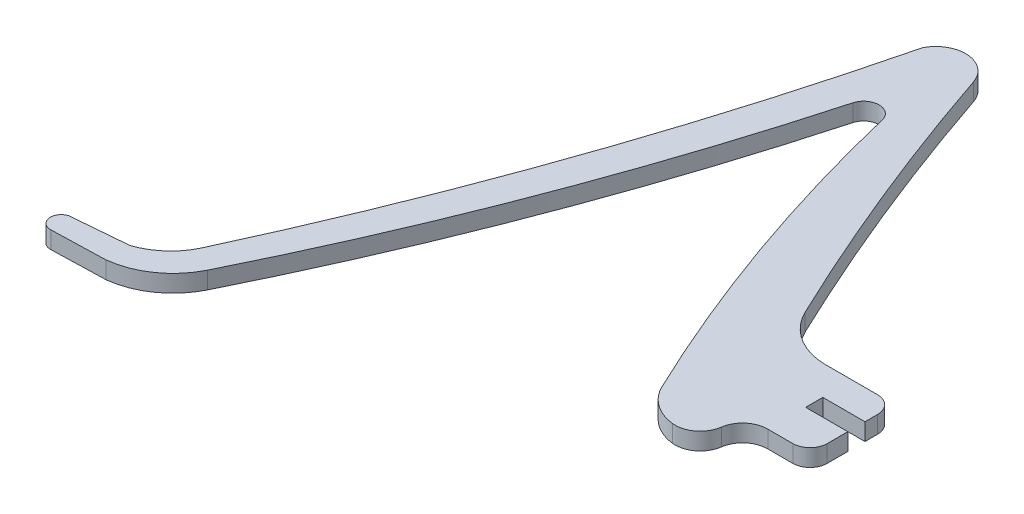
ISO-10303-21;
HEADER;
FILE_DESCRIPTION(('STEP AP214'),'2;1');
FILE_NAME('part.step','',(''),(''),'','','');
FILE_SCHEMA(('AUTOMOTIVE_DESIGN { 1 0 10303 214 1 1 1 1 }'));
ENDSEC;
DATA;
#1=APPLICATION_CONTEXT('core data for automotive mechanical design processes');
#2=APPLICATION_PROTOCOL_DEFINITION('international standard','automotive_design',2000,#1);
#3=PRODUCT_CONTEXT('',#1,'mechanical');
#4=PRODUCT('Part','Part','',(#3));
#5=PRODUCT_RELATED_PRODUCT_CATEGORY('part','',(#4));
#6=PRODUCT_DEFINITION_FORMATION('','',#4);
#7=PRODUCT_DEFINITION_CONTEXT('part definition',#1,'design');
#8=PRODUCT_DEFINITION('design','',#6,#7);
#9=PRODUCT_DEFINITION_SHAPE('','',#8);
#10=(LENGTH_UNIT() NAMED_UNIT(*) SI_UNIT(.MILLI.,.METRE.));
#11=(NAMED_UNIT(*) PLANE_ANGLE_UNIT() SI_UNIT($,.RADIAN.));
#12=(NAMED_UNIT(*) SI_UNIT($,.STERADIAN.) SOLID_ANGLE_UNIT());
#13=UNCERTAINTY_MEASURE_WITH_UNIT(LENGTH_MEASURE(1.E-05),#10,'distance_accuracy_value','');
#14=(GEOMETRIC_REPRESENTATION_CONTEXT(3) GLOBAL_UNCERTAINTY_ASSIGNED_CONTEXT((#13)) GLOBAL_UNIT_ASSIGNED_CONTEXT((#10,
#11,#12)) REPRESENTATION_CONTEXT('',''));
#15=CARTESIAN_POINT('',(0.,0.,0.));
#16=DIRECTION('',(0.,0.,1.));
#17=DIRECTION('',(1.,0.,0.));
#18=AXIS2_PLACEMENT_3D('',#15,#16,#17);
#19=CARTESIAN_POINT('',(-41736.5703119899,3.,-18202.859375344));
#20=DIRECTION('',(0.,-1.,0.));
#21=DIRECTION('',(0.,0.,-1.));
#22=AXIS2_PLACEMENT_3D('',#19,#20,#21);
#23=CYLINDRICAL_SURFACE('',#22,1.87725099870067);
#24=CARTESIAN_POINT('',(-41736.5703119899,0.,-18202.859375344));
#25=DIRECTION('',(0.,1.,0.));
#26=DIRECTION('',(0.,0.,1.));
#27=AXIS2_PLACEMENT_3D('',#24,#25,#26);
#28=CIRCLE('',#27,1.87725099870067);
#29=CARTESIAN_POINT('',(-41736.402871,0.,-18204.729144));
#30=VERTEX_POINT('',#29);
#31=CARTESIAN_POINT('',(-41736.517584,0.,-18200.982865));
#32=VERTEX_POINT('',#31);
#33=EDGE_CURVE('E227',#30,#32,#28,.T.);
#34=ORIENTED_EDGE('',*,*,#33,.T.);
#35=DIRECTION('',(0.,-1.,0.));
#36=VECTOR('',#35,1.);
#37=CARTESIAN_POINT('',(-41736.517584,3.,-18200.982865));
#38=LINE('',#37,#36);
#39=CARTESIAN_POINT('',(-41736.517584,3.,-18200.982865));
#40=VERTEX_POINT('',#39);
#41=EDGE_CURVE('E11',#40,#32,#38,.T.);
#42=ORIENTED_EDGE('',*,*,#41,.F.);
#43=CARTESIAN_POINT('',(-41736.5703119899,3.,-18202.859375344));
#44=DIRECTION('',(0.,1.,0.));
#45=DIRECTION('',(0.,0.,1.));
#46=AXIS2_PLACEMENT_3D('',#43,#44,#45);
#47=CIRCLE('',#46,1.87725099870067);
#48=CARTESIAN_POINT('',(-41736.402871,3.,-18204.729144));
#49=VERTEX_POINT('',#48);
#50=EDGE_CURVE('E273',#49,#40,#47,.T.);
#51=ORIENTED_EDGE('',*,*,#50,.F.);
#52=DIRECTION('',(0.,-1.,0.));
#53=VECTOR('',#52,1.);
#54=CARTESIAN_POINT('',(-41736.402871,3.,-18204.729144));
#55=LINE('',#54,#53);
#56=EDGE_CURVE('E223',#49,#30,#55,.T.);
#57=ORIENTED_EDGE('',*,*,#56,.T.);
#58=EDGE_LOOP('',(#34,#42,#51,#57));
#59=FACE_BOUND('',#58,.T.);
#60=ADVANCED_FACE('F35',(#59),#23,.T.);
#61=CARTESIAN_POINT('',(-41736.517584,3.,-18200.982865));
#62=DIRECTION('',(-0.0281516864041227,0.,-0.999603662734688));
#63=DIRECTION('',(-0.999603662734688,0.,0.0281516864041227));
#64=AXIS2_PLACEMENT_3D('',#61,#62,#63);
#65=PLANE('',#64);
#66=DIRECTION('',(0.999603662734688,0.,-0.0281516864041227));
#67=VECTOR('',#66,1.);
#68=CARTESIAN_POINT('',(-41736.517584,0.,-18200.982865));
#69=LINE('',#68,#67);
#70=CARTESIAN_POINT('',(-41727.101562,0.,-18201.248047));
#71=VERTEX_POINT('',#70);
#72=EDGE_CURVE('E230',#32,#71,#69,.T.);
#73=ORIENTED_EDGE('',*,*,#72,.T.);
#74=DIRECTION('',(0.,-1.,0.));
#75=VECTOR('',#74,1.);
#76=CARTESIAN_POINT('',(-41727.101562,3.,-18201.248047));
#77=LINE('',#76,#75);
#78=CARTESIAN_POINT('',(-41727.101562,3.,-18201.248047));
#79=VERTEX_POINT('',#78);
#80=EDGE_CURVE('E43',#79,#71,#77,.T.);
#81=ORIENTED_EDGE('',*,*,#80,.F.);
#82=DIRECTION('',(0.999603662734688,0.,-0.0281516864041227));
#83=VECTOR('',#82,1.);
#84=CARTESIAN_POINT('',(-41736.517584,3.,-18200.982865));
#85=LINE('',#84,#83);
#86=EDGE_CURVE('E142',#40,#79,#85,.T.);
#87=ORIENTED_EDGE('',*,*,#86,.F.);
#88=ORIENTED_EDGE('',*,*,#41,.T.);
#89=EDGE_LOOP('',(#73,#81,#87,#88));
#90=FACE_BOUND('',#89,.T.);
#91=ADVANCED_FACE('F411',(#90),#65,.F.);
#92=CARTESIAN_POINT('',(-41728.6495248528,3.,-18214.4523570761));
#93=DIRECTION('',(0.,-1.,0.));
#94=DIRECTION('',(0.,0.,-1.));
#95=AXIS2_PLACEMENT_3D('',#92,#93,#94);
#96=CYLINDRICAL_SURFACE('',#95,13.2947355587996);
#97=CARTESIAN_POINT('',(-41728.6495248528,0.,-18214.4523570761));
#98=DIRECTION('',(0.,1.,0.));
#99=DIRECTION('',(0.,0.,1.));
#100=AXIS2_PLACEMENT_3D('',#97,#98,#99);
#101=CIRCLE('',#100,13.2947355587996);
#102=CARTESIAN_POINT('',(-41716.7257579999,0.,-18208.57241));
#103=VERTEX_POINT('',#102);
#104=EDGE_CURVE('E232',#71,#103,#101,.T.);
#105=ORIENTED_EDGE('',*,*,#104,.T.);
#106=DIRECTION('',(0.,-1.,0.));
#107=VECTOR('',#106,1.);
#108=CARTESIAN_POINT('',(-41716.7257579999,3.,-18208.57241));
#109=LINE('',#108,#107);
#110=CARTESIAN_POINT('',(-41716.7257579999,3.,-18208.57241));
#111=VERTEX_POINT('',#110);
#112=EDGE_CURVE('E328',#111,#103,#109,.T.);
#113=ORIENTED_EDGE('',*,*,#112,.F.);
#114=CARTESIAN_POINT('',(-41728.6495248528,3.,-18214.4523570761));
#115=DIRECTION('',(0.,1.,0.));
#116=DIRECTION('',(0.,0.,1.));
#117=AXIS2_PLACEMENT_3D('',#114,#115,#116);
#118=CIRCLE('',#117,13.2947355587996);
#119=EDGE_CURVE('E336',#79,#111,#118,.T.);
#120=ORIENTED_EDGE('',*,*,#119,.F.);
#121=ORIENTED_EDGE('',*,*,#80,.T.);
#122=EDGE_LOOP('',(#105,#113,#120,#121));
#123=FACE_BOUND('',#122,.T.);
#124=ADVANCED_FACE('F334',(#123),#96,.T.);
#125=CARTESIAN_POINT('',(-42129.610875578,3.,-18412.1957815943));
#126=DIRECTION('',(0.,-1.,0.));
#127=DIRECTION('',(0.,0.,-1.));
#128=AXIS2_PLACEMENT_3D('',#125,#126,#127);
#129=CYLINDRICAL_SURFACE('',#128,460.365721765698);
#130=CARTESIAN_POINT('',(-42129.610875578,0.,-18412.1957815943));
#131=DIRECTION('',(0.,1.,0.));
#132=DIRECTION('',(0.,0.,1.));
#133=AXIS2_PLACEMENT_3D('',#130,#131,#132);
#134=CIRCLE('',#133,460.365721765698);
#135=CARTESIAN_POINT('',(-41685.712916,0.,-18290.1662800001));
#136=VERTEX_POINT('',#135);
#137=EDGE_CURVE('E234',#103,#136,#134,.T.);
#138=ORIENTED_EDGE('',*,*,#137,.T.);
#139=DIRECTION('',(0.,-1.,0.));
#140=VECTOR('',#139,1.);
#141=CARTESIAN_POINT('',(-41685.712916,3.,-18290.1662800001));
#142=LINE('',#141,#140);
#143=CARTESIAN_POINT('',(-41685.712916,3.,-18290.1662800001));
#144=VERTEX_POINT('',#143);
#145=EDGE_CURVE('E325',#144,#136,#142,.T.);
#146=ORIENTED_EDGE('',*,*,#145,.F.);
#147=CARTESIAN_POINT('',(-42129.610875578,3.,-18412.1957815943));
#148=DIRECTION('',(0.,1.,0.));
#149=DIRECTION('',(0.,0.,1.));
#150=AXIS2_PLACEMENT_3D('',#147,#148,#149);
#151=CIRCLE('',#150,460.365721765698);
#152=EDGE_CURVE('E354',#111,#144,#151,.T.);
#153=ORIENTED_EDGE('',*,*,#152,.F.);
#154=ORIENTED_EDGE('',*,*,#112,.T.);
#155=EDGE_LOOP('',(#138,#146,#153,#154));
#156=FACE_BOUND('',#155,.T.);
#157=ADVANCED_FACE('F345',(#156),#129,.T.);
#158=CARTESIAN_POINT('',(-41683.1202207019,3.,-18289.4531815504));
#159=DIRECTION('',(0.,-1.,0.));
#160=DIRECTION('',(0.,0.,-1.));
#161=AXIS2_PLACEMENT_3D('',#158,#159,#160);
#162=CYLINDRICAL_SURFACE('',#161,2.68897346726469);
#163=CARTESIAN_POINT('',(-41683.1202207019,0.,-18289.4531815504));
#164=DIRECTION('',(0.,-1.,0.));
#165=DIRECTION('',(0.,0.,1.));
#166=AXIS2_PLACEMENT_3D('',#163,#164,#165);
#167=CIRCLE('',#166,2.68897346726469);
#168=CARTESIAN_POINT('',(-41680.641146,0.,-18290.494703));
#169=VERTEX_POINT('',#168);
#170=EDGE_CURVE('E236',#136,#169,#167,.T.);
#171=ORIENTED_EDGE('',*,*,#170,.T.);
#172=DIRECTION('',(0.,-1.,0.));
#173=VECTOR('',#172,1.);
#174=CARTESIAN_POINT('',(-41680.641146,3.,-18290.494703));
#175=LINE('',#174,#173);
#176=CARTESIAN_POINT('',(-41680.641146,3.,-18290.494703));
#177=VERTEX_POINT('',#176);
#178=EDGE_CURVE('E322',#177,#169,#175,.T.);
#179=ORIENTED_EDGE('',*,*,#178,.F.);
#180=CARTESIAN_POINT('',(-41683.1202207019,3.,-18289.4531815504));
#181=DIRECTION('',(0.,-1.,0.));
#182=DIRECTION('',(0.,0.,1.));
#183=AXIS2_PLACEMENT_3D('',#180,#181,#182);
#184=CIRCLE('',#183,2.68897346726469);
#185=EDGE_CURVE('E351',#144,#177,#184,.T.);
#186=ORIENTED_EDGE('',*,*,#185,.F.);
#187=ORIENTED_EDGE('',*,*,#145,.T.);
#188=EDGE_LOOP('',(#171,#179,#186,#187));
#189=FACE_BOUND('',#188,.T.);
#190=ADVANCED_FACE('F349',(#189),#162,.F.);
#191=CARTESIAN_POINT('',(-41388.5252984147,3.,-18360.1380724928));
#192=DIRECTION('',(0.,-1.,0.));
#193=DIRECTION('',(0.,0.,-1.));
#194=AXIS2_PLACEMENT_3D('',#191,#192,#193);
#195=CYLINDRICAL_SURFACE('',#194,300.302959234102);
#196=CARTESIAN_POINT('',(-41388.5252984147,0.,-18360.1380724928));
#197=DIRECTION('',(0.,1.,0.));
#198=DIRECTION('',(0.,0.,1.));
#199=AXIS2_PLACEMENT_3D('',#196,#197,#198);
#200=CIRCLE('',#199,300.302959234102);
#201=CARTESIAN_POINT('',(-41659.432339,0.,-18230.5570450002));
#202=VERTEX_POINT('',#201);
#203=EDGE_CURVE('E238',#169,#202,#200,.T.);
#204=ORIENTED_EDGE('',*,*,#203,.T.);
#205=DIRECTION('',(0.,-1.,0.));
#206=VECTOR('',#205,1.);
#207=CARTESIAN_POINT('',(-41659.432339,3.,-18230.5570450002));
#208=LINE('',#207,#206);
#209=CARTESIAN_POINT('',(-41659.432339,3.,-18230.5570450002));
#210=VERTEX_POINT('',#209);
#211=EDGE_CURVE('E319',#210,#202,#208,.T.);
#212=ORIENTED_EDGE('',*,*,#211,.F.);
#213=CARTESIAN_POINT('',(-41388.5252984147,3.,-18360.1380724928));
#214=DIRECTION('',(0.,1.,0.));
#215=DIRECTION('',(0.,0.,1.));
#216=AXIS2_PLACEMENT_3D('',#213,#214,#215);
#217=CIRCLE('',#216,300.302959234102);
#218=EDGE_CURVE('E353',#177,#210,#217,.T.);
#219=ORIENTED_EDGE('',*,*,#218,.F.);
#220=ORIENTED_EDGE('',*,*,#178,.T.);
#221=EDGE_LOOP('',(#204,#212,#219,#220));
#222=FACE_BOUND('',#221,.T.);
#223=ADVANCED_FACE('F424',(#222),#195,.T.);
#224=CARTESIAN_POINT('',(-41652.049504064,3.,-18234.0869775304));
#225=DIRECTION('',(0.,-1.,0.));
#226=DIRECTION('',(0.,0.,-1.));
#227=AXIS2_PLACEMENT_3D('',#224,#225,#226);
#228=CYLINDRICAL_SURFACE('',#227,8.18331689239969);
#229=CARTESIAN_POINT('',(-41652.049504064,0.,-18234.0869775304));
#230=DIRECTION('',(0.,1.,0.));
#231=DIRECTION('',(0.,0.,1.));
#232=AXIS2_PLACEMENT_3D('',#229,#230,#231);
#233=CIRCLE('',#232,8.18331689239969);
#234=CARTESIAN_POINT('',(-41653.00576,0.,-18225.9597240001));
#235=VERTEX_POINT('',#234);
#236=EDGE_CURVE('E240',#202,#235,#233,.T.);
#237=ORIENTED_EDGE('',*,*,#236,.T.);
#238=DIRECTION('',(0.,-1.,0.));
#239=VECTOR('',#238,1.);
#240=CARTESIAN_POINT('',(-41653.00576,3.,-18225.9597240001));
#241=LINE('',#240,#239);
#242=CARTESIAN_POINT('',(-41653.00576,3.,-18225.9597240001));
#243=VERTEX_POINT('',#242);
#244=EDGE_CURVE('E316',#243,#235,#241,.T.);
#245=ORIENTED_EDGE('',*,*,#244,.F.);
#246=CARTESIAN_POINT('',(-41652.049504064,3.,-18234.0869775304));
#247=DIRECTION('',(0.,1.,0.));
#248=DIRECTION('',(0.,0.,1.));
#249=AXIS2_PLACEMENT_3D('',#246,#247,#248);
#250=CIRCLE('',#249,8.18331689239969);
#251=EDGE_CURVE('E356',#210,#243,#250,.T.);
#252=ORIENTED_EDGE('',*,*,#251,.F.);
#253=ORIENTED_EDGE('',*,*,#211,.T.);
#254=EDGE_LOOP('',(#237,#245,#252,#253));
#255=FACE_BOUND('',#254,.T.);
#256=ADVANCED_FACE('F427',(#255),#228,.T.);
#257=CARTESIAN_POINT('',(-41652.4920338298,3.,-18230.2989458031));
#258=DIRECTION('',(0.,-1.,0.));
#259=DIRECTION('',(0.,0.,-1.));
#260=AXIS2_PLACEMENT_3D('',#257,#258,#259);
#261=CYLINDRICAL_SURFACE('',#260,4.36952633969769);
#262=CARTESIAN_POINT('',(-41652.4920338298,0.,-18230.2989458031));
#263=DIRECTION('',(0.,1.,0.));
#264=DIRECTION('',(0.,0.,1.));
#265=AXIS2_PLACEMENT_3D('',#262,#263,#264);
#266=CIRCLE('',#265,4.36952633969769);
#267=CARTESIAN_POINT('',(-41648.166319,0.,-18229.681733));
#268=VERTEX_POINT('',#267);
#269=EDGE_CURVE('E242',#235,#268,#266,.T.);
#270=ORIENTED_EDGE('',*,*,#269,.T.);
#271=DIRECTION('',(0.,-1.,0.));
#272=VECTOR('',#271,1.);
#273=CARTESIAN_POINT('',(-41648.166319,3.,-18229.681733));
#274=LINE('',#273,#272);
#275=CARTESIAN_POINT('',(-41648.166319,3.,-18229.681733));
#276=VERTEX_POINT('',#275);
#277=EDGE_CURVE('E313',#276,#268,#274,.T.);
#278=ORIENTED_EDGE('',*,*,#277,.F.);
#279=CARTESIAN_POINT('',(-41652.4920338298,3.,-18230.2989458031));
#280=DIRECTION('',(0.,1.,0.));
#281=DIRECTION('',(0.,0.,1.));
#282=AXIS2_PLACEMENT_3D('',#279,#280,#281);
#283=CIRCLE('',#282,4.36952633969769);
#284=EDGE_CURVE('E362',#243,#276,#283,.T.);
#285=ORIENTED_EDGE('',*,*,#284,.F.);
#286=ORIENTED_EDGE('',*,*,#244,.T.);
#287=EDGE_LOOP('',(#270,#278,#285,#286));
#288=FACE_BOUND('',#287,.T.);
#289=ADVANCED_FACE('F431',(#288),#261,.T.);
#290=CARTESIAN_POINT('',(-41643.8549400753,3.,-18229.0668609535));
#291=DIRECTION('',(0.,-1.,0.));
#292=DIRECTION('',(0.,0.,-1.));
#293=AXIS2_PLACEMENT_3D('',#290,#291,#292);
#294=CYLINDRICAL_SURFACE('',#293,4.35500354369241);
#295=CARTESIAN_POINT('',(-41643.8549400753,0.,-18229.0668609535));
#296=DIRECTION('',(0.,-1.,0.));
#297=DIRECTION('',(0.,0.,1.));
#298=AXIS2_PLACEMENT_3D('',#295,#296,#297);
#299=CIRCLE('',#298,4.35500354369241);
#300=CARTESIAN_POINT('',(-41643.818257,0.,-18233.42171));
#301=VERTEX_POINT('',#300);
#302=EDGE_CURVE('E244',#268,#301,#299,.T.);
#303=ORIENTED_EDGE('',*,*,#302,.T.);
#304=DIRECTION('',(0.,-1.,0.));
#305=VECTOR('',#304,1.);
#306=CARTESIAN_POINT('',(-41643.818257,3.,-18233.42171));
#307=LINE('',#306,#305);
#308=CARTESIAN_POINT('',(-41643.818257,3.,-18233.42171));
#309=VERTEX_POINT('',#308);
#310=EDGE_CURVE('E310',#309,#301,#307,.T.);
#311=ORIENTED_EDGE('',*,*,#310,.F.);
#312=CARTESIAN_POINT('',(-41643.8549400753,3.,-18229.0668609535));
#313=DIRECTION('',(0.,-1.,0.));
#314=DIRECTION('',(0.,0.,1.));
#315=AXIS2_PLACEMENT_3D('',#312,#313,#314);
#316=CIRCLE('',#315,4.35500354369241);
#317=EDGE_CURVE('E364',#276,#309,#316,.T.);
#318=ORIENTED_EDGE('',*,*,#317,.F.);
#319=ORIENTED_EDGE('',*,*,#277,.T.);
#320=EDGE_LOOP('',(#303,#311,#318,#319));
#321=FACE_BOUND('',#320,.T.);
#322=ADVANCED_FACE('F435',(#321),#294,.F.);
#323=CARTESIAN_POINT('',(-41643.818257,3.,-18233.42171));
#324=DIRECTION('',(-0.000483909498973431,0.,-0.999999882915791));
#325=DIRECTION('',(-0.999999882915792,0.,0.000483909498973431));
#326=AXIS2_PLACEMENT_3D('',#323,#324,#325);
#327=PLANE('',#326);
#328=DIRECTION('',(0.999999882915791,0.,-0.000483909498973431));
#329=VECTOR('',#328,1.);
#330=CARTESIAN_POINT('',(-41643.818257,0.,-18233.42171));
#331=LINE('',#330,#329);
#332=CARTESIAN_POINT('',(-41639.441406,0.,-18233.423828));
#333=VERTEX_POINT('',#332);
#334=EDGE_CURVE('E246',#301,#333,#331,.T.);
#335=ORIENTED_EDGE('',*,*,#334,.T.);
#336=DIRECTION('',(0.,-1.,0.));
#337=VECTOR('',#336,1.);
#338=CARTESIAN_POINT('',(-41639.441406,3.,-18233.423828));
#339=LINE('',#338,#337);
#340=CARTESIAN_POINT('',(-41639.441406,3.,-18233.423828));
#341=VERTEX_POINT('',#340);
#342=EDGE_CURVE('E307',#341,#333,#339,.T.);
#343=ORIENTED_EDGE('',*,*,#342,.F.);
#344=DIRECTION('',(0.999999882915791,0.,-0.000483909498973431));
#345=VECTOR('',#344,1.);
#346=CARTESIAN_POINT('',(-41643.818257,3.,-18233.42171));
#347=LINE('',#346,#345);
#348=EDGE_CURVE('E366',#309,#341,#347,.T.);
#349=ORIENTED_EDGE('',*,*,#348,.F.);
#350=ORIENTED_EDGE('',*,*,#310,.T.);
#351=EDGE_LOOP('',(#335,#343,#349,#350));
#352=FACE_BOUND('',#351,.T.);
#353=ADVANCED_FACE('F439',(#352),#327,.F.);
#354=CARTESIAN_POINT('',(-41639.4423819775,3.,-18236.4248038828));
#355=DIRECTION('',(0.,-1.,0.));
#356=DIRECTION('',(0.,0.,-1.));
#357=AXIS2_PLACEMENT_3D('',#354,#355,#356);
#358=CYLINDRICAL_SURFACE('',#357,3.00097604149666);
#359=CARTESIAN_POINT('',(-41639.4423819775,0.,-18236.4248038828));
#360=DIRECTION('',(0.,1.,0.));
#361=DIRECTION('',(0.,0.,1.));
#362=AXIS2_PLACEMENT_3D('',#359,#360,#361);
#363=CIRCLE('',#362,3.00097604149666);
#364=CARTESIAN_POINT('',(-41636.441407,0.,-18236.427331));
#365=VERTEX_POINT('',#364);
#366=EDGE_CURVE('E248',#333,#365,#363,.T.);
#367=ORIENTED_EDGE('',*,*,#366,.T.);
#368=DIRECTION('',(0.,-1.,0.));
#369=VECTOR('',#368,1.);
#370=CARTESIAN_POINT('',(-41636.441407,3.,-18236.427331));
#371=LINE('',#370,#369);
#372=CARTESIAN_POINT('',(-41636.441407,3.,-18236.427331));
#373=VERTEX_POINT('',#372);
#374=EDGE_CURVE('E304',#373,#365,#371,.T.);
#375=ORIENTED_EDGE('',*,*,#374,.F.);
#376=CARTESIAN_POINT('',(-41639.4423819775,3.,-18236.4248038828));
#377=DIRECTION('',(0.,1.,0.));
#378=DIRECTION('',(0.,0.,1.));
#379=AXIS2_PLACEMENT_3D('',#376,#377,#378);
#380=CIRCLE('',#379,3.00097604149666);
#381=EDGE_CURVE('E368',#341,#373,#380,.T.);
#382=ORIENTED_EDGE('',*,*,#381,.F.);
#383=ORIENTED_EDGE('',*,*,#342,.T.);
#384=EDGE_LOOP('',(#367,#375,#382,#383));
#385=FACE_BOUND('',#384,.T.);
#386=ADVANCED_FACE('F443',(#385),#358,.T.);
#387=CARTESIAN_POINT('',(-41636.441407,3.,-18236.427331));
#388=DIRECTION('',(-0.999999409773687,0.,0.00108648620675218));
#389=DIRECTION('',(0.00108648620675218,0.,0.999999409773687));
#390=AXIS2_PLACEMENT_3D('',#387,#388,#389);
#391=PLANE('',#390);
#392=DIRECTION('',(-0.00108648620675218,0.,-0.999999409773687));
#393=VECTOR('',#392,1.);
#394=CARTESIAN_POINT('',(-41636.441407,0.,-18236.427331));
#395=LINE('',#394,#393);
#396=CARTESIAN_POINT('',(-41636.445312,0.,-18240.021484));
#397=VERTEX_POINT('',#396);
#398=EDGE_CURVE('E250',#365,#397,#395,.T.);
#399=ORIENTED_EDGE('',*,*,#398,.T.);
#400=DIRECTION('',(0.,-1.,0.));
#401=VECTOR('',#400,1.);
#402=CARTESIAN_POINT('',(-41636.445312,3.,-18240.021484));
#403=LINE('',#402,#401);
#404=CARTESIAN_POINT('',(-41636.445312,3.,-18240.021484));
#405=VERTEX_POINT('',#404);
#406=EDGE_CURVE('E301',#405,#397,#403,.T.);
#407=ORIENTED_EDGE('',*,*,#406,.F.);
#408=DIRECTION('',(-0.00108648620675218,0.,-0.999999409773687));
#409=VECTOR('',#408,1.);
#410=CARTESIAN_POINT('',(-41636.441407,3.,-18236.427331));
#411=LINE('',#410,#409);
#412=EDGE_CURVE('E370',#373,#405,#411,.T.);
#413=ORIENTED_EDGE('',*,*,#412,.F.);
#414=ORIENTED_EDGE('',*,*,#374,.T.);
#415=EDGE_LOOP('',(#399,#407,#413,#414));
#416=FACE_BOUND('',#415,.T.);
#417=ADVANCED_FACE('F447',(#416),#391,.F.);
#418=CARTESIAN_POINT('',(-41636.445312,3.,-18240.021484));
#419=DIRECTION('',(0.,0.,1.));
#420=DIRECTION('',(1.,0.,0.));
#421=AXIS2_PLACEMENT_3D('',#418,#419,#420);
#422=PLANE('',#421);
#423=DIRECTION('',(-1.,0.,0.));
#424=VECTOR('',#423,1.);
#425=CARTESIAN_POINT('',(-41636.445312,0.,-18240.021484));
#426=LINE('',#425,#424);
#427=CARTESIAN_POINT('',(-41643.804687,0.,-18240.021484));
#428=VERTEX_POINT('',#427);
#429=EDGE_CURVE('E252',#397,#428,#426,.T.);
#430=ORIENTED_EDGE('',*,*,#429,.T.);
#431=DIRECTION('',(0.,-1.,0.));
#432=VECTOR('',#431,1.);
#433=CARTESIAN_POINT('',(-41643.804687,3.,-18240.021484));
#434=LINE('',#433,#432);
#435=CARTESIAN_POINT('',(-41643.804687,3.,-18240.021484));
#436=VERTEX_POINT('',#435);
#437=EDGE_CURVE('E298',#436,#428,#434,.T.);
#438=ORIENTED_EDGE('',*,*,#437,.F.);
#439=DIRECTION('',(-1.,0.,0.));
#440=VECTOR('',#439,1.);
#441=CARTESIAN_POINT('',(-41636.445312,3.,-18240.021484));
#442=LINE('',#441,#440);
#443=EDGE_CURVE('E372',#405,#436,#442,.T.);
#444=ORIENTED_EDGE('',*,*,#443,.F.);
#445=ORIENTED_EDGE('',*,*,#406,.T.);
#446=EDGE_LOOP('',(#430,#438,#444,#445));
#447=FACE_BOUND('',#446,.T.);
#448=ADVANCED_FACE('F451',(#447),#422,.F.);
#449=CARTESIAN_POINT('',(-41643.804687,3.,-18240.021484));
#450=DIRECTION('',(-0.999999151965026,0.,0.00130233222653049));
#451=DIRECTION('',(0.00130233222653049,0.,0.999999151965026));
#452=AXIS2_PLACEMENT_3D('',#449,#450,#451);
#453=PLANE('',#452);
#454=DIRECTION('',(-0.00130233222653049,0.,-0.999999151965026));
#455=VECTOR('',#454,1.);
#456=CARTESIAN_POINT('',(-41643.804687,0.,-18240.021484));
#457=LINE('',#456,#455);
#458=CARTESIAN_POINT('',(-41643.808594,0.,-18243.021484));
#459=VERTEX_POINT('',#458);
#460=EDGE_CURVE('E254',#428,#459,#457,.T.);
#461=ORIENTED_EDGE('',*,*,#460,.T.);
#462=DIRECTION('',(0.,-1.,0.));
#463=VECTOR('',#462,1.);
#464=CARTESIAN_POINT('',(-41643.808594,3.,-18243.021484));
#465=LINE('',#464,#463);
#466=CARTESIAN_POINT('',(-41643.808594,3.,-18243.021484));
#467=VERTEX_POINT('',#466);
#468=EDGE_CURVE('E295',#467,#459,#465,.T.);
#469=ORIENTED_EDGE('',*,*,#468,.F.);
#470=DIRECTION('',(-0.00130233222653049,0.,-0.999999151965026));
#471=VECTOR('',#470,1.);
#472=CARTESIAN_POINT('',(-41643.804687,3.,-18240.021484));
#473=LINE('',#472,#471);
#474=EDGE_CURVE('E374',#436,#467,#473,.T.);
#475=ORIENTED_EDGE('',*,*,#474,.F.);
#476=ORIENTED_EDGE('',*,*,#437,.T.);
#477=EDGE_LOOP('',(#461,#469,#475,#476));
#478=FACE_BOUND('',#477,.T.);
#479=ADVANCED_FACE('F455',(#478),#453,.F.);
#480=CARTESIAN_POINT('',(-41643.808594,3.,-18243.021484));
#481=DIRECTION('',(0.,0.,-1.));
#482=DIRECTION('',(-1.,0.,0.));
#483=AXIS2_PLACEMENT_3D('',#480,#481,#482);
#484=PLANE('',#483);
#485=DIRECTION('',(1.,0.,0.));
#486=VECTOR('',#485,1.);
#487=CARTESIAN_POINT('',(-41643.808594,0.,-18243.021484));
#488=LINE('',#487,#486);
#489=CARTESIAN_POINT('',(-41636.449219,0.,-18243.021484));
#490=VERTEX_POINT('',#489);
#491=EDGE_CURVE('E256',#459,#490,#488,.T.);
#492=ORIENTED_EDGE('',*,*,#491,.T.);
#493=DIRECTION('',(0.,-1.,0.));
#494=VECTOR('',#493,1.);
#495=CARTESIAN_POINT('',(-41636.449219,3.,-18243.021484));
#496=LINE('',#495,#494);
#497=CARTESIAN_POINT('',(-41636.449219,3.,-18243.021484));
#498=VERTEX_POINT('',#497);
#499=EDGE_CURVE('E292',#498,#490,#496,.T.);
#500=ORIENTED_EDGE('',*,*,#499,.F.);
#501=DIRECTION('',(1.,0.,0.));
#502=VECTOR('',#501,1.);
#503=CARTESIAN_POINT('',(-41643.808594,3.,-18243.021484));
#504=LINE('',#503,#502);
#505=EDGE_CURVE('E376',#467,#498,#504,.T.);
#506=ORIENTED_EDGE('',*,*,#505,.F.);
#507=ORIENTED_EDGE('',*,*,#468,.T.);
#508=EDGE_LOOP('',(#492,#500,#506,#507));
#509=FACE_BOUND('',#508,.T.);
#510=ADVANCED_FACE('F459',(#509),#484,.F.);
#511=CARTESIAN_POINT('',(-41636.449219,3.,-18243.021484));
#512=DIRECTION('',(-0.999998399292434,0.,-0.00178924916394859));
#513=DIRECTION('',(-0.00178924916394859,0.,0.999998399292434));
#514=AXIS2_PLACEMENT_3D('',#511,#512,#513);
#515=PLANE('',#514);
#516=DIRECTION('',(0.00178924916394859,0.,-0.999998399292434));
#517=VECTOR('',#516,1.);
#518=CARTESIAN_POINT('',(-41636.449219,0.,-18243.021484));
#519=LINE('',#518,#517);
#520=CARTESIAN_POINT('',(-41636.445312,0.,-18245.205078));
#521=VERTEX_POINT('',#520);
#522=EDGE_CURVE('E258',#490,#521,#519,.T.);
#523=ORIENTED_EDGE('',*,*,#522,.T.);
#524=DIRECTION('',(0.,-1.,0.));
#525=VECTOR('',#524,1.);
#526=CARTESIAN_POINT('',(-41636.445312,3.,-18245.205078));
#527=LINE('',#526,#525);
#528=CARTESIAN_POINT('',(-41636.445312,3.,-18245.205078));
#529=VERTEX_POINT('',#528);
#530=EDGE_CURVE('E289',#529,#521,#527,.T.);
#531=ORIENTED_EDGE('',*,*,#530,.F.);
#532=DIRECTION('',(0.00178924916394859,0.,-0.999998399292434));
#533=VECTOR('',#532,1.);
#534=CARTESIAN_POINT('',(-41636.449219,3.,-18243.021484));
#535=LINE('',#534,#533);
#536=EDGE_CURVE('E378',#498,#529,#535,.T.);
#537=ORIENTED_EDGE('',*,*,#536,.F.);
#538=ORIENTED_EDGE('',*,*,#499,.T.);
#539=EDGE_LOOP('',(#523,#531,#537,#538));
#540=FACE_BOUND('',#539,.T.);
#541=ADVANCED_FACE('F463',(#540),#515,.F.);
#542=CARTESIAN_POINT('',(-41639.445312,3.,-18245.205078));
#543=DIRECTION('',(0.,-1.,0.));
#544=DIRECTION('',(0.,0.,-1.));
#545=AXIS2_PLACEMENT_3D('',#542,#543,#544);
#546=CYLINDRICAL_SURFACE('',#545,3.0000000000002);
#547=CARTESIAN_POINT('',(-41639.445312,0.,-18245.205078));
#548=DIRECTION('',(0.,1.,0.));
#549=DIRECTION('',(0.,0.,1.));
#550=AXIS2_PLACEMENT_3D('',#547,#548,#549);
#551=CIRCLE('',#550,3.0000000000002);
#552=CARTESIAN_POINT('',(-41639.445313,0.,-18248.205078));
#553=VERTEX_POINT('',#552);
#554=EDGE_CURVE('E260',#521,#553,#551,.T.);
#555=ORIENTED_EDGE('',*,*,#554,.T.);
#556=DIRECTION('',(0.,-1.,0.));
#557=VECTOR('',#556,1.);
#558=CARTESIAN_POINT('',(-41639.445313,3.,-18248.205078));
#559=LINE('',#558,#557);
#560=CARTESIAN_POINT('',(-41639.445313,3.,-18248.205078));
#561=VERTEX_POINT('',#560);
#562=EDGE_CURVE('E286',#561,#553,#559,.T.);
#563=ORIENTED_EDGE('',*,*,#562,.F.);
#564=CARTESIAN_POINT('',(-41639.445312,3.,-18245.205078));
#565=DIRECTION('',(0.,1.,0.));
#566=DIRECTION('',(0.,0.,1.));
#567=AXIS2_PLACEMENT_3D('',#564,#565,#566);
#568=CIRCLE('',#567,3.0000000000002);
#569=EDGE_CURVE('E380',#529,#561,#568,.T.);
#570=ORIENTED_EDGE('',*,*,#569,.F.);
#571=ORIENTED_EDGE('',*,*,#530,.T.);
#572=EDGE_LOOP('',(#555,#563,#570,#571));
#573=FACE_BOUND('',#572,.T.);
#574=ADVANCED_FACE('F467',(#573),#546,.T.);
#575=CARTESIAN_POINT('',(-41639.445313,3.,-18248.205078));
#576=DIRECTION('',(0.000209982361170116,0.,0.999999977953704));
#577=DIRECTION('',(0.999999977953704,0.,-0.000209982361170116));
#578=AXIS2_PLACEMENT_3D('',#575,#576,#577);
#579=PLANE('',#578);
#580=DIRECTION('',(-0.999999977953704,0.,0.000209982361170116));
#581=VECTOR('',#580,1.);
#582=CARTESIAN_POINT('',(-41639.445313,0.,-18248.205078));
#583=LINE('',#582,#581);
#584=CARTESIAN_POINT('',(-41648.746094,0.,-18248.203125));
#585=VERTEX_POINT('',#584);
#586=EDGE_CURVE('E262',#553,#585,#583,.T.);
#587=ORIENTED_EDGE('',*,*,#586,.T.);
#588=DIRECTION('',(0.,-1.,0.));
#589=VECTOR('',#588,1.);
#590=CARTESIAN_POINT('',(-41648.746094,3.,-18248.203125));
#591=LINE('',#590,#589);
#592=CARTESIAN_POINT('',(-41648.746094,3.,-18248.203125));
#593=VERTEX_POINT('',#592);
#594=EDGE_CURVE('E283',#593,#585,#591,.T.);
#595=ORIENTED_EDGE('',*,*,#594,.F.);
#596=DIRECTION('',(-0.999999977953704,0.,0.000209982361170116));
#597=VECTOR('',#596,1.);
#598=CARTESIAN_POINT('',(-41639.445313,3.,-18248.205078));
#599=LINE('',#598,#597);
#600=EDGE_CURVE('E382',#561,#593,#599,.T.);
#601=ORIENTED_EDGE('',*,*,#600,.F.);
#602=ORIENTED_EDGE('',*,*,#562,.T.);
#603=EDGE_LOOP('',(#587,#595,#601,#602));
#604=FACE_BOUND('',#603,.T.);
#605=ADVANCED_FACE('F471',(#604),#579,.F.);
#606=CARTESIAN_POINT('',(-41648.4418663766,3.,-18259.0563531198));
#607=DIRECTION('',(0.,-1.,0.));
#608=DIRECTION('',(0.,0.,-1.));
#609=AXIS2_PLACEMENT_3D('',#606,#607,#608);
#610=CYLINDRICAL_SURFACE('',#609,10.8574911958055);
#611=CARTESIAN_POINT('',(-41648.4418663766,0.,-18259.0563531198));
#612=DIRECTION('',(0.,-1.,0.));
#613=DIRECTION('',(0.,0.,1.));
#614=AXIS2_PLACEMENT_3D('',#611,#612,#613);
#615=CIRCLE('',#614,10.8574911958055);
#616=CARTESIAN_POINT('',(-41658.2392889998,0.,-18254.3770769997));
#617=VERTEX_POINT('',#616);
#618=EDGE_CURVE('E264',#585,#617,#615,.T.);
#619=ORIENTED_EDGE('',*,*,#618,.T.);
#620=DIRECTION('',(0.,-1.,0.));
#621=VECTOR('',#620,1.);
#622=CARTESIAN_POINT('',(-41658.2392889998,3.,-18254.3770769997));
#623=LINE('',#622,#621);
#624=CARTESIAN_POINT('',(-41658.2392889998,3.,-18254.3770769997));
#625=VERTEX_POINT('',#624);
#626=EDGE_CURVE('E280',#625,#617,#623,.T.);
#627=ORIENTED_EDGE('',*,*,#626,.F.);
#628=CARTESIAN_POINT('',(-41648.4418663766,3.,-18259.0563531198));
#629=DIRECTION('',(0.,-1.,0.));
#630=DIRECTION('',(0.,0.,1.));
#631=AXIS2_PLACEMENT_3D('',#628,#629,#630);
#632=CIRCLE('',#631,10.8574911958055);
#633=EDGE_CURVE('E384',#593,#625,#632,.T.);
#634=ORIENTED_EDGE('',*,*,#633,.F.);
#635=ORIENTED_EDGE('',*,*,#594,.T.);
#636=EDGE_LOOP('',(#619,#627,#634,#635));
#637=FACE_BOUND('',#636,.T.);
#638=ADVANCED_FACE('F475',(#637),#610,.F.);
#639=CARTESIAN_POINT('',(-41256.5940102466,3.,-18446.4104951507));
#640=DIRECTION('',(0.,-1.,0.));
#641=DIRECTION('',(0.,0.,-1.));
#642=AXIS2_PLACEMENT_3D('',#639,#640,#641);
#643=CYLINDRICAL_SURFACE('',#642,445.191827902897);
#644=CARTESIAN_POINT('',(-41256.5940102466,0.,-18446.4104951507));
#645=DIRECTION('',(0.,-1.,0.));
#646=DIRECTION('',(0.,0.,1.));
#647=AXIS2_PLACEMENT_3D('',#644,#645,#646);
#648=CIRCLE('',#647,445.191827902897);
#649=CARTESIAN_POINT('',(-41678.3575139999,0.,-18303.8927399997));
#650=VERTEX_POINT('',#649);
#651=EDGE_CURVE('E266',#617,#650,#648,.T.);
#652=ORIENTED_EDGE('',*,*,#651,.T.);
#653=DIRECTION('',(0.,-1.,0.));
#654=VECTOR('',#653,1.);
#655=CARTESIAN_POINT('',(-41678.3575139999,3.,-18303.8927399997));
#656=LINE('',#655,#654);
#657=CARTESIAN_POINT('',(-41678.3575139999,3.,-18303.8927399997));
#658=VERTEX_POINT('',#657);
#659=EDGE_CURVE('E277',#658,#650,#656,.T.);
#660=ORIENTED_EDGE('',*,*,#659,.F.);
#661=CARTESIAN_POINT('',(-41256.5940102466,3.,-18446.4104951507));
#662=DIRECTION('',(0.,-1.,0.));
#663=DIRECTION('',(0.,0.,1.));
#664=AXIS2_PLACEMENT_3D('',#661,#662,#663);
#665=CIRCLE('',#664,445.191827902897);
#666=EDGE_CURVE('E386',#625,#658,#665,.T.);
#667=ORIENTED_EDGE('',*,*,#666,.F.);
#668=ORIENTED_EDGE('',*,*,#626,.T.);
#669=EDGE_LOOP('',(#652,#660,#667,#668));
#670=FACE_BOUND('',#669,.T.);
#671=ADVANCED_FACE('F392',(#670),#643,.F.);
#672=CARTESIAN_POINT('',(-41683.3039239779,3.,-18302.2206459363));
#673=DIRECTION('',(0.,-1.,0.));
#674=DIRECTION('',(0.,0.,-1.));
#675=AXIS2_PLACEMENT_3D('',#672,#673,#674);
#676=CYLINDRICAL_SURFACE('',#675,5.22138585319558);
#677=CARTESIAN_POINT('',(-41683.3039239779,0.,-18302.2206459363));
#678=DIRECTION('',(0.,1.,0.));
#679=DIRECTION('',(0.,0.,1.));
#680=AXIS2_PLACEMENT_3D('',#677,#678,#679);
#681=CIRCLE('',#680,5.22138585319558);
#682=CARTESIAN_POINT('',(-41687.946601,0.,-18304.609876));
#683=VERTEX_POINT('',#682);
#684=EDGE_CURVE('E268',#650,#683,#681,.T.);
#685=ORIENTED_EDGE('',*,*,#684,.T.);
#686=DIRECTION('',(0.,-1.,0.));
#687=VECTOR('',#686,1.);
#688=CARTESIAN_POINT('',(-41687.946601,3.,-18304.609876));
#689=LINE('',#688,#687);
#690=CARTESIAN_POINT('',(-41687.946601,3.,-18304.609876));
#691=VERTEX_POINT('',#690);
#692=EDGE_CURVE('E218',#691,#683,#689,.T.);
#693=ORIENTED_EDGE('',*,*,#692,.F.);
#694=CARTESIAN_POINT('',(-41683.3039239779,3.,-18302.2206459363));
#695=DIRECTION('',(0.,1.,0.));
#696=DIRECTION('',(0.,0.,1.));
#697=AXIS2_PLACEMENT_3D('',#694,#695,#696);
#698=CIRCLE('',#697,5.22138585319558);
#699=EDGE_CURVE('E209',#658,#691,#698,.T.);
#700=ORIENTED_EDGE('',*,*,#699,.F.);
#701=ORIENTED_EDGE('',*,*,#659,.T.);
#702=EDGE_LOOP('',(#685,#693,#700,#701));
#703=FACE_BOUND('',#702,.T.);
#704=ADVANCED_FACE('F396',(#703),#676,.T.);
#705=CARTESIAN_POINT('',(-42189.2444629209,3.,-18427.9036616749));
#706=DIRECTION('',(0.,-1.,0.));
#707=DIRECTION('',(0.,0.,-1.));
#708=AXIS2_PLACEMENT_3D('',#705,#706,#707);
#709=CYLINDRICAL_SURFACE('',#708,516.237255486813);
#710=CARTESIAN_POINT('',(-42189.2444629209,0.,-18427.9036616749));
#711=DIRECTION('',(0.,-1.,0.));
#712=DIRECTION('',(0.,0.,1.));
#713=AXIS2_PLACEMENT_3D('',#710,#711,#712);
#714=CIRCLE('',#713,516.237255486813);
#715=CARTESIAN_POINT('',(-41720.646896,0.,-18211.29982));
#716=VERTEX_POINT('',#715);
#717=EDGE_CURVE('E217',#683,#716,#714,.T.);
#718=ORIENTED_EDGE('',*,*,#717,.T.);
#719=DIRECTION('',(0.,-1.,0.));
#720=VECTOR('',#719,1.);
#721=CARTESIAN_POINT('',(-41720.646896,3.,-18211.29982));
#722=LINE('',#721,#720);
#723=CARTESIAN_POINT('',(-41720.646896,3.,-18211.29982));
#724=VERTEX_POINT('',#723);
#725=EDGE_CURVE('E214',#724,#716,#722,.T.);
#726=ORIENTED_EDGE('',*,*,#725,.F.);
#727=CARTESIAN_POINT('',(-42189.2444629209,3.,-18427.9036616749));
#728=DIRECTION('',(0.,-1.,0.));
#729=DIRECTION('',(0.,0.,1.));
#730=AXIS2_PLACEMENT_3D('',#727,#728,#729);
#731=CIRCLE('',#730,516.237255486813);
#732=EDGE_CURVE('E203',#691,#724,#731,.T.);
#733=ORIENTED_EDGE('',*,*,#732,.F.);
#734=ORIENTED_EDGE('',*,*,#692,.T.);
#735=EDGE_LOOP('',(#718,#726,#733,#734));
#736=FACE_BOUND('',#735,.T.);
#737=ADVANCED_FACE('F215',(#736),#709,.F.);
#738=CARTESIAN_POINT('',(-41730.7533559653,3.,-18216.1762636534));
#739=DIRECTION('',(0.,-1.,0.));
#740=DIRECTION('',(0.,0.,-1.));
#741=AXIS2_PLACEMENT_3D('',#738,#739,#740);
#742=CYLINDRICAL_SURFACE('',#741,11.2214186151028);
#743=CARTESIAN_POINT('',(-41730.7533559653,0.,-18216.1762636534));
#744=DIRECTION('',(0.,-1.,0.));
#745=DIRECTION('',(0.,0.,1.));
#746=AXIS2_PLACEMENT_3D('',#743,#744,#745);
#747=CIRCLE('',#746,11.2214186151028);
#748=CARTESIAN_POINT('',(-41727.231527,0.,-18205.52183));
#749=VERTEX_POINT('',#748);
#750=EDGE_CURVE('E128',#716,#749,#747,.T.);
#751=ORIENTED_EDGE('',*,*,#750,.T.);
#752=DIRECTION('',(0.,-1.,0.));
#753=VECTOR('',#752,1.);
#754=CARTESIAN_POINT('',(-41727.231527,3.,-18205.52183));
#755=LINE('',#754,#753);
#756=CARTESIAN_POINT('',(-41727.231527,3.,-18205.52183));
#757=VERTEX_POINT('',#756);
#758=EDGE_CURVE('E219',#757,#749,#755,.T.);
#759=ORIENTED_EDGE('',*,*,#758,.F.);
#760=CARTESIAN_POINT('',(-41730.7533559653,3.,-18216.1762636534));
#761=DIRECTION('',(0.,-1.,0.));
#762=DIRECTION('',(0.,0.,1.));
#763=AXIS2_PLACEMENT_3D('',#760,#761,#762);
#764=CIRCLE('',#763,11.2214186151028);
#765=EDGE_CURVE('E207',#724,#757,#764,.T.);
#766=ORIENTED_EDGE('',*,*,#765,.F.);
#767=ORIENTED_EDGE('',*,*,#725,.T.);
#768=EDGE_LOOP('',(#751,#759,#766,#767));
#769=FACE_BOUND('',#768,.T.);
#770=ADVANCED_FACE('F221',(#769),#742,.F.);
#771=CARTESIAN_POINT('',(-41727.231527,3.,-18205.52183));
#772=DIRECTION('',(0.086109701682843,0.,0.996285661482735));
#773=DIRECTION('',(0.996285661482736,0.,-0.086109701682843));
#774=AXIS2_PLACEMENT_3D('',#771,#772,#773);
#775=PLANE('',#774);
#776=DIRECTION('',(-0.996285661482735,0.,0.086109701682843));
#777=VECTOR('',#776,1.);
#778=CARTESIAN_POINT('',(-41727.231527,0.,-18205.52183));
#779=LINE('',#778,#777);
#780=EDGE_CURVE('E134',#749,#30,#779,.T.);
#781=ORIENTED_EDGE('',*,*,#780,.T.);
#782=ORIENTED_EDGE('',*,*,#56,.F.);
#783=DIRECTION('',(-0.996285661482735,0.,0.086109701682843));
#784=VECTOR('',#783,1.);
#785=CARTESIAN_POINT('',(-41727.231527,3.,-18205.52183));
#786=LINE('',#785,#784);
#787=EDGE_CURVE('E51',#757,#49,#786,.T.);
#788=ORIENTED_EDGE('',*,*,#787,.F.);
#789=ORIENTED_EDGE('',*,*,#758,.T.);
#790=EDGE_LOOP('',(#781,#782,#788,#789));
#791=FACE_BOUND('',#790,.T.);
#792=ADVANCED_FACE('F400',(#791),#775,.F.);
#793=CARTESIAN_POINT('',(-41736.5703119899,3.,-18202.859375344));
#794=DIRECTION('',(0.,1.,0.));
#795=DIRECTION('',(0.,0.,1.));
#796=AXIS2_PLACEMENT_3D('',#793,#794,#795);
#797=PLANE('',#796);
#798=ORIENTED_EDGE('',*,*,#50,.T.);
#799=ORIENTED_EDGE('',*,*,#86,.T.);
#800=ORIENTED_EDGE('',*,*,#119,.T.);
#801=ORIENTED_EDGE('',*,*,#152,.T.);
#802=ORIENTED_EDGE('',*,*,#185,.T.);
#803=ORIENTED_EDGE('',*,*,#218,.T.);
#804=ORIENTED_EDGE('',*,*,#251,.T.);
#805=ORIENTED_EDGE('',*,*,#284,.T.);
#806=ORIENTED_EDGE('',*,*,#317,.T.);
#807=ORIENTED_EDGE('',*,*,#348,.T.);
#808=ORIENTED_EDGE('',*,*,#381,.T.);
#809=ORIENTED_EDGE('',*,*,#412,.T.);
#810=ORIENTED_EDGE('',*,*,#443,.T.);
#811=ORIENTED_EDGE('',*,*,#474,.T.);
#812=ORIENTED_EDGE('',*,*,#505,.T.);
#813=ORIENTED_EDGE('',*,*,#536,.T.);
#814=ORIENTED_EDGE('',*,*,#569,.T.);
#815=ORIENTED_EDGE('',*,*,#600,.T.);
#816=ORIENTED_EDGE('',*,*,#633,.T.);
#817=ORIENTED_EDGE('',*,*,#666,.T.);
#818=ORIENTED_EDGE('',*,*,#699,.T.);
#819=ORIENTED_EDGE('',*,*,#732,.T.);
#820=ORIENTED_EDGE('',*,*,#765,.T.);
#821=ORIENTED_EDGE('',*,*,#787,.T.);
#822=EDGE_LOOP('',(#798,#799,#800,#801,#802,#803,#804,#805,#806,#807,#808,#809,#810,#811,#812,
#813,#814,#815,#816,#817,#818,#819,#820,#821));
#823=FACE_BOUND('',#822,.T.);
#824=ADVANCED_FACE('F205',(#823),#797,.T.);
#825=CARTESIAN_POINT('',(-41736.5703119899,0.,-18202.859375344));
#826=DIRECTION('',(0.,1.,0.));
#827=DIRECTION('',(0.,0.,1.));
#828=AXIS2_PLACEMENT_3D('',#825,#826,#827);
#829=PLANE('',#828);
#830=ORIENTED_EDGE('',*,*,#33,.F.);
#831=ORIENTED_EDGE('',*,*,#780,.F.);
#832=ORIENTED_EDGE('',*,*,#750,.F.);
#833=ORIENTED_EDGE('',*,*,#717,.F.);
#834=ORIENTED_EDGE('',*,*,#684,.F.);
#835=ORIENTED_EDGE('',*,*,#651,.F.);
#836=ORIENTED_EDGE('',*,*,#618,.F.);
#837=ORIENTED_EDGE('',*,*,#586,.F.);
#838=ORIENTED_EDGE('',*,*,#554,.F.);
#839=ORIENTED_EDGE('',*,*,#522,.F.);
#840=ORIENTED_EDGE('',*,*,#491,.F.);
#841=ORIENTED_EDGE('',*,*,#460,.F.);
#842=ORIENTED_EDGE('',*,*,#429,.F.);
#843=ORIENTED_EDGE('',*,*,#398,.F.);
#844=ORIENTED_EDGE('',*,*,#366,.F.);
#845=ORIENTED_EDGE('',*,*,#334,.F.);
#846=ORIENTED_EDGE('',*,*,#302,.F.);
#847=ORIENTED_EDGE('',*,*,#269,.F.);
#848=ORIENTED_EDGE('',*,*,#236,.F.);
#849=ORIENTED_EDGE('',*,*,#203,.F.);
#850=ORIENTED_EDGE('',*,*,#170,.F.);
#851=ORIENTED_EDGE('',*,*,#137,.F.);
#852=ORIENTED_EDGE('',*,*,#104,.F.);
#853=ORIENTED_EDGE('',*,*,#72,.F.);
#854=EDGE_LOOP('',(#830,#831,#832,#833,#834,#835,#836,#837,#838,#839,#840,#841,#842,#843,#844,
#845,#846,#847,#848,#849,#850,#851,#852,#853));
#855=FACE_BOUND('',#854,.T.);
#856=ADVANCED_FACE('F340',(#855),#829,.F.);
#857=CLOSED_SHELL('',(#60,#91,#124,#157,#190,#223,#256,#289,#322,#353,#386,#417,#448,#479,#510,
#541,#574,#605,#638,#671,#704,#737,#770,#792,#824,#856));
#858=MANIFOLD_SOLID_BREP('B2',#857);
#859=ADVANCED_BREP_SHAPE_REPRESENTATION('',(#18,#858),#14);
#860=SHAPE_DEFINITION_REPRESENTATION(#9,#859);
ENDSEC;
END-ISO-10303-21;
